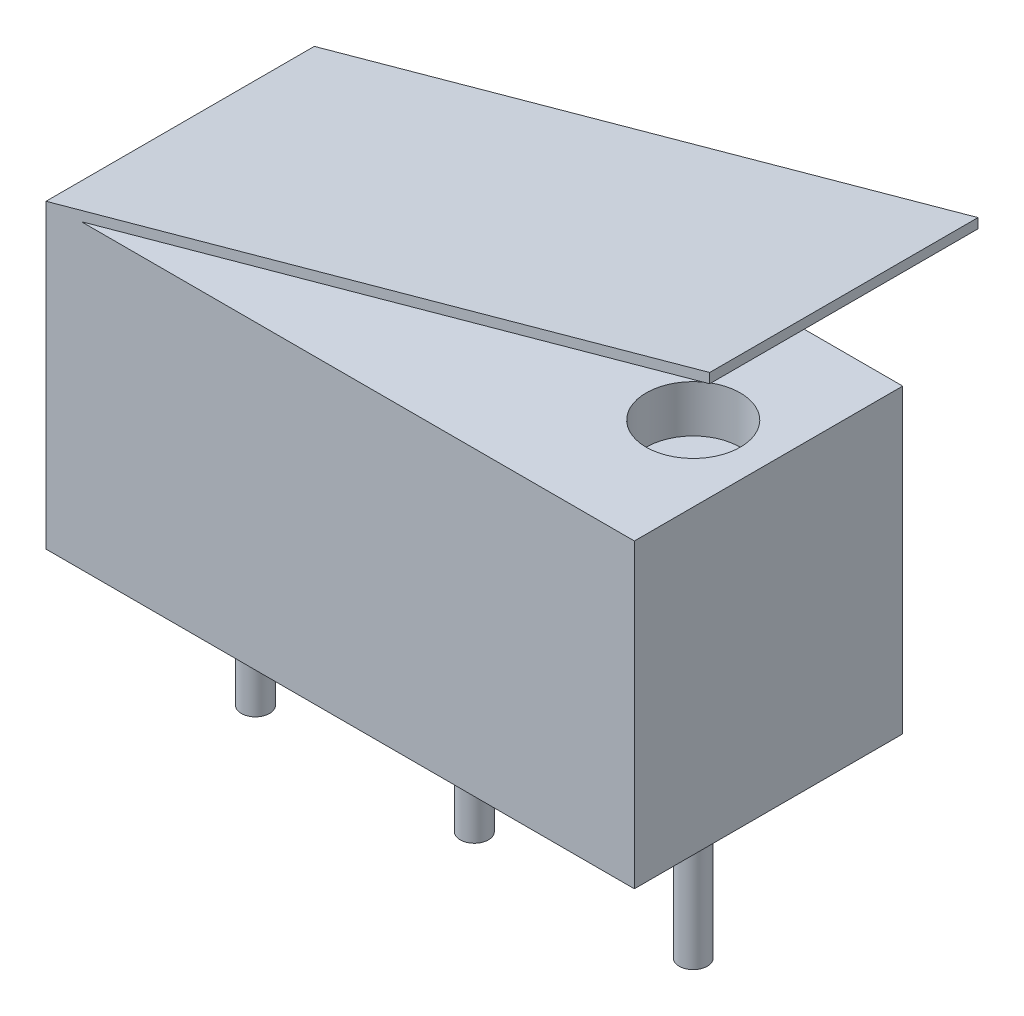
ISO-10303-21;
HEADER;
FILE_DESCRIPTION(('STEP AP214'),'2;1');
FILE_NAME('part.step','',(''),(''),'','','');
FILE_SCHEMA(('AUTOMOTIVE_DESIGN { 1 0 10303 214 1 1 1 1 }'));
ENDSEC;
DATA;
#1=APPLICATION_CONTEXT('core data for automotive mechanical design processes');
#2=APPLICATION_PROTOCOL_DEFINITION('international standard','automotive_design',2000,#1);
#3=PRODUCT_CONTEXT('',#1,'mechanical');
#4=PRODUCT('Part','Part','',(#3));
#5=PRODUCT_RELATED_PRODUCT_CATEGORY('part','',(#4));
#6=PRODUCT_DEFINITION_FORMATION('','',#4);
#7=PRODUCT_DEFINITION_CONTEXT('part definition',#1,'design');
#8=PRODUCT_DEFINITION('design','',#6,#7);
#9=PRODUCT_DEFINITION_SHAPE('','',#8);
#10=(LENGTH_UNIT() NAMED_UNIT(*) SI_UNIT(.MILLI.,.METRE.));
#11=(NAMED_UNIT(*) PLANE_ANGLE_UNIT() SI_UNIT($,.RADIAN.));
#12=(NAMED_UNIT(*) SI_UNIT($,.STERADIAN.) SOLID_ANGLE_UNIT());
#13=UNCERTAINTY_MEASURE_WITH_UNIT(LENGTH_MEASURE(1.E-05),#10,'distance_accuracy_value','');
#14=(GEOMETRIC_REPRESENTATION_CONTEXT(3) GLOBAL_UNCERTAINTY_ASSIGNED_CONTEXT((#13)) GLOBAL_UNIT_ASSIGNED_CONTEXT((#10,
#11,#12)) REPRESENTATION_CONTEXT('',''));
#15=CARTESIAN_POINT('',(0.,0.,0.));
#16=DIRECTION('',(0.,0.,1.));
#17=DIRECTION('',(1.,0.,0.));
#18=AXIS2_PLACEMENT_3D('',#15,#16,#17);
#19=CARTESIAN_POINT('',(-5.11363636363637,6.4,-3.35624999999999));
#20=DIRECTION('',(1.,0.,0.));
#21=DIRECTION('',(0.,0.,-1.));
#22=AXIS2_PLACEMENT_3D('',#19,#20,#21);
#23=PLANE('',#22);
#24=DIRECTION('',(0.,0.,1.));
#25=VECTOR('',#24,1.);
#26=CARTESIAN_POINT('',(-5.11363636363637,0.,-3.35624999999999));
#27=LINE('',#26,#25);
#28=CARTESIAN_POINT('',(-5.11363636363637,0.,-3.35624999999999));
#29=VERTEX_POINT('',#28);
#30=CARTESIAN_POINT('',(-5.11363636363637,0.,2.34375000000001));
#31=VERTEX_POINT('',#30);
#32=EDGE_CURVE('E125',#29,#31,#27,.T.);
#33=ORIENTED_EDGE('',*,*,#32,.T.);
#34=DIRECTION('',(0.,-1.,0.));
#35=VECTOR('',#34,1.);
#36=CARTESIAN_POINT('',(-5.11363636363637,6.4,2.34375000000001));
#37=LINE('',#36,#35);
#38=CARTESIAN_POINT('',(-5.11363636363637,6.4,2.34375000000001));
#39=VERTEX_POINT('',#38);
#40=EDGE_CURVE('E151',#39,#31,#37,.T.);
#41=ORIENTED_EDGE('',*,*,#40,.F.);
#42=DIRECTION('',(0.,0.,1.));
#43=VECTOR('',#42,1.);
#44=CARTESIAN_POINT('',(-5.11363636363637,6.4,-3.35624999999999));
#45=LINE('',#44,#43);
#46=CARTESIAN_POINT('',(-5.11363636363637,6.4,-3.35624999999999));
#47=VERTEX_POINT('',#46);
#48=EDGE_CURVE('E127',#47,#39,#45,.T.);
#49=ORIENTED_EDGE('',*,*,#48,.F.);
#50=DIRECTION('',(0.,-1.,0.));
#51=VECTOR('',#50,1.);
#52=CARTESIAN_POINT('',(-5.11363636363637,6.4,-3.35624999999999));
#53=LINE('',#52,#51);
#54=EDGE_CURVE('E135',#47,#29,#53,.T.);
#55=ORIENTED_EDGE('',*,*,#54,.T.);
#56=EDGE_LOOP('',(#33,#41,#49,#55));
#57=FACE_BOUND('',#56,.T.);
#58=ADVANCED_FACE('F37',(#57),#23,.F.);
#59=CARTESIAN_POINT('',(-5.11363636363637,6.4,2.34375000000001));
#60=DIRECTION('',(0.,0.,-1.));
#61=DIRECTION('',(-1.,0.,0.));
#62=AXIS2_PLACEMENT_3D('',#59,#60,#61);
#63=PLANE('',#62);
#64=DIRECTION('',(1.,0.,0.));
#65=VECTOR('',#64,1.);
#66=CARTESIAN_POINT('',(-5.11363636363637,6.4,2.34375000000001));
#67=LINE('',#66,#65);
#68=CARTESIAN_POINT('',(-4.36340957346796,6.4,2.34375000000001));
#69=VERTEX_POINT('',#68);
#70=CARTESIAN_POINT('',(7.38636363636363,6.4,2.34375000000001));
#71=VERTEX_POINT('',#70);
#72=EDGE_CURVE('E101',#69,#71,#67,.T.);
#73=ORIENTED_EDGE('',*,*,#72,.F.);
#74=DIRECTION('',(0.963811120254198,0.266586054538395,0.));
#75=VECTOR('',#74,1.);
#76=CARTESIAN_POINT('',(-5.11363636363637,6.19249046229385,2.34375000000001));
#77=LINE('',#76,#75);
#78=CARTESIAN_POINT('',(8.98636363636363,10.0924904622938,2.34375000000001));
#79=VERTEX_POINT('',#78);
#80=EDGE_CURVE('E93',#69,#79,#77,.T.);
#81=ORIENTED_EDGE('',*,*,#80,.T.);
#82=DIRECTION('',(0.,1.,0.));
#83=VECTOR('',#82,1.);
#84=CARTESIAN_POINT('',(8.98636363636363,10.3,2.34375000000001));
#85=LINE('',#84,#83);
#86=CARTESIAN_POINT('',(8.98636363636363,10.3,2.34375000000001));
#87=VERTEX_POINT('',#86);
#88=EDGE_CURVE('E98',#79,#87,#85,.T.);
#89=ORIENTED_EDGE('',*,*,#88,.T.);
#90=DIRECTION('',(-0.963811120254198,-0.266586054538395,0.));
#91=VECTOR('',#90,1.);
#92=CARTESIAN_POINT('',(-5.11363636363637,6.4,2.34375000000001));
#93=LINE('',#92,#91);
#94=EDGE_CURVE('E114',#87,#39,#93,.T.);
#95=ORIENTED_EDGE('',*,*,#94,.T.);
#96=ORIENTED_EDGE('',*,*,#40,.T.);
#97=DIRECTION('',(1.,0.,0.));
#98=VECTOR('',#97,1.);
#99=CARTESIAN_POINT('',(-5.11363636363637,0.,2.34375000000001));
#100=LINE('',#99,#98);
#101=CARTESIAN_POINT('',(7.38636363636363,0.,2.34375000000001));
#102=VERTEX_POINT('',#101);
#103=EDGE_CURVE('E138',#31,#102,#100,.T.);
#104=ORIENTED_EDGE('',*,*,#103,.T.);
#105=DIRECTION('',(0.,-1.,0.));
#106=VECTOR('',#105,1.);
#107=CARTESIAN_POINT('',(7.38636363636363,6.4,2.34375000000001));
#108=LINE('',#107,#106);
#109=EDGE_CURVE('E148',#71,#102,#108,.T.);
#110=ORIENTED_EDGE('',*,*,#109,.F.);
#111=EDGE_LOOP('',(#73,#81,#89,#95,#96,#104,#110));
#112=FACE_BOUND('',#111,.T.);
#113=ADVANCED_FACE('F95',(#112),#63,.F.);
#114=CARTESIAN_POINT('',(7.38636363636363,6.4,-3.35624999999999));
#115=DIRECTION('',(-1.,0.,0.));
#116=DIRECTION('',(0.,0.,1.));
#117=AXIS2_PLACEMENT_3D('',#114,#115,#116);
#118=PLANE('',#117);
#119=DIRECTION('',(0.,0.,-1.));
#120=VECTOR('',#119,1.);
#121=CARTESIAN_POINT('',(7.38636363636363,0.,-3.35624999999999));
#122=LINE('',#121,#120);
#123=CARTESIAN_POINT('',(7.38636363636363,0.,-3.35624999999999));
#124=VERTEX_POINT('',#123);
#125=EDGE_CURVE('E140',#102,#124,#122,.T.);
#126=ORIENTED_EDGE('',*,*,#125,.T.);
#127=DIRECTION('',(0.,-1.,0.));
#128=VECTOR('',#127,1.);
#129=CARTESIAN_POINT('',(7.38636363636363,6.4,-3.35624999999999));
#130=LINE('',#129,#128);
#131=CARTESIAN_POINT('',(7.38636363636363,6.4,-3.35624999999999));
#132=VERTEX_POINT('',#131);
#133=EDGE_CURVE('E145',#132,#124,#130,.T.);
#134=ORIENTED_EDGE('',*,*,#133,.F.);
#135=DIRECTION('',(0.,0.,-1.));
#136=VECTOR('',#135,1.);
#137=CARTESIAN_POINT('',(7.38636363636363,6.4,-3.35624999999999));
#138=LINE('',#137,#136);
#139=EDGE_CURVE('E132',#71,#132,#138,.T.);
#140=ORIENTED_EDGE('',*,*,#139,.F.);
#141=ORIENTED_EDGE('',*,*,#109,.T.);
#142=EDGE_LOOP('',(#126,#134,#140,#141));
#143=FACE_BOUND('',#142,.T.);
#144=ADVANCED_FACE('F182',(#143),#118,.F.);
#145=CARTESIAN_POINT('',(-5.11363636363637,6.4,-3.35624999999999));
#146=DIRECTION('',(0.,0.,1.));
#147=DIRECTION('',(1.,0.,0.));
#148=AXIS2_PLACEMENT_3D('',#145,#146,#147);
#149=PLANE('',#148);
#150=DIRECTION('',(-1.,0.,0.));
#151=VECTOR('',#150,1.);
#152=CARTESIAN_POINT('',(-5.11363636363637,0.,-3.35624999999999));
#153=LINE('',#152,#151);
#154=EDGE_CURVE('E130',#124,#29,#153,.T.);
#155=ORIENTED_EDGE('',*,*,#154,.T.);
#156=ORIENTED_EDGE('',*,*,#54,.F.);
#157=DIRECTION('',(0.963811120254198,0.266586054538395,0.));
#158=VECTOR('',#157,1.);
#159=CARTESIAN_POINT('',(-5.11363636363637,6.4,-3.35624999999999));
#160=LINE('',#159,#158);
#161=CARTESIAN_POINT('',(8.98636363636363,10.3,-3.35624999999999));
#162=VERTEX_POINT('',#161);
#163=EDGE_CURVE('E126',#47,#162,#160,.T.);
#164=ORIENTED_EDGE('',*,*,#163,.T.);
#165=DIRECTION('',(0.,-1.,0.));
#166=VECTOR('',#165,1.);
#167=CARTESIAN_POINT('',(8.98636363636363,10.3,-3.35624999999999));
#168=LINE('',#167,#166);
#169=CARTESIAN_POINT('',(8.98636363636363,10.0924904622938,-3.35624999999999));
#170=VERTEX_POINT('',#169);
#171=EDGE_CURVE('E122',#162,#170,#168,.T.);
#172=ORIENTED_EDGE('',*,*,#171,.T.);
#173=DIRECTION('',(-0.963811120254198,-0.266586054538395,0.));
#174=VECTOR('',#173,1.);
#175=CARTESIAN_POINT('',(-5.11363636363637,6.19249046229385,-3.35624999999999));
#176=LINE('',#175,#174);
#177=CARTESIAN_POINT('',(-4.36340957346796,6.4,-3.35624999999999));
#178=VERTEX_POINT('',#177);
#179=EDGE_CURVE('E110',#170,#178,#176,.T.);
#180=ORIENTED_EDGE('',*,*,#179,.T.);
#181=DIRECTION('',(-1.,0.,0.));
#182=VECTOR('',#181,1.);
#183=CARTESIAN_POINT('',(-5.11363636363637,6.4,-3.35624999999999));
#184=LINE('',#183,#182);
#185=EDGE_CURVE('E51',#132,#178,#184,.T.);
#186=ORIENTED_EDGE('',*,*,#185,.F.);
#187=ORIENTED_EDGE('',*,*,#133,.T.);
#188=EDGE_LOOP('',(#155,#156,#164,#172,#180,#186,#187));
#189=FACE_BOUND('',#188,.T.);
#190=ADVANCED_FACE('F178',(#189),#149,.F.);
#191=CARTESIAN_POINT('',(0.,6.4,0.));
#192=DIRECTION('',(0.,1.,0.));
#193=DIRECTION('',(0.,0.,1.));
#194=AXIS2_PLACEMENT_3D('',#191,#192,#193);
#195=PLANE('',#194);
#196=CARTESIAN_POINT('',(5.78636363636363,6.4,-0.506249999999992));
#197=DIRECTION('',(0.,1.,0.));
#198=DIRECTION('',(0.,0.,1.));
#199=AXIS2_PLACEMENT_3D('',#196,#197,#198);
#200=CIRCLE('',#199,1.);
#201=CARTESIAN_POINT('',(5.78636363636363,6.4,0.493750000000007));
#202=VERTEX_POINT('',#201);
#203=EDGE_CURVE('E195',#202,#202,#200,.T.);
#204=ORIENTED_EDGE('',*,*,#203,.F.);
#205=EDGE_LOOP('',(#204));
#206=FACE_BOUND('',#205,.T.);
#207=DIRECTION('',(0.,0.,-1.));
#208=VECTOR('',#207,1.);
#209=CARTESIAN_POINT('',(-4.36340957346797,6.4,0.));
#210=LINE('',#209,#208);
#211=EDGE_CURVE('E55',#69,#178,#210,.T.);
#212=ORIENTED_EDGE('',*,*,#211,.F.);
#213=ORIENTED_EDGE('',*,*,#72,.T.);
#214=ORIENTED_EDGE('',*,*,#139,.T.);
#215=ORIENTED_EDGE('',*,*,#185,.T.);
#216=EDGE_LOOP('',(#212,#213,#214,#215));
#217=FACE_BOUND('',#216,.T.);
#218=ADVANCED_FACE('F165',(#206,#217),#195,.T.);
#219=CARTESIAN_POINT('',(0.,0.,0.));
#220=DIRECTION('',(0.,1.,0.));
#221=DIRECTION('',(0.,0.,1.));
#222=AXIS2_PLACEMENT_3D('',#219,#220,#221);
#223=PLANE('',#222);
#224=CARTESIAN_POINT('',(5.78636363636363,0.,-0.506249999999992));
#225=DIRECTION('',(0.,1.,0.));
#226=DIRECTION('',(0.,0.,1.));
#227=AXIS2_PLACEMENT_3D('',#224,#225,#226);
#228=CIRCLE('',#227,0.3);
#229=CARTESIAN_POINT('',(5.78636363636363,0.,-0.206249999999992));
#230=VERTEX_POINT('',#229);
#231=EDGE_CURVE('E12',#230,#230,#228,.F.);
#232=ORIENTED_EDGE('',*,*,#231,.F.);
#233=EDGE_LOOP('',(#232));
#234=FACE_BOUND('',#233,.T.);
#235=CARTESIAN_POINT('',(1.13636363636363,0.,-0.506249999999994));
#236=DIRECTION('',(0.,1.,0.));
#237=DIRECTION('',(0.,0.,1.));
#238=AXIS2_PLACEMENT_3D('',#235,#236,#237);
#239=CIRCLE('',#238,0.3);
#240=CARTESIAN_POINT('',(1.13636363636363,0.,-0.206249999999994));
#241=VERTEX_POINT('',#240);
#242=EDGE_CURVE('E44',#241,#241,#239,.F.);
#243=ORIENTED_EDGE('',*,*,#242,.F.);
#244=EDGE_LOOP('',(#243));
#245=FACE_BOUND('',#244,.T.);
#246=CARTESIAN_POINT('',(-3.51363636363638,0.,-0.506249999999994));
#247=DIRECTION('',(0.,1.,0.));
#248=DIRECTION('',(0.,0.,1.));
#249=AXIS2_PLACEMENT_3D('',#246,#247,#248);
#250=CIRCLE('',#249,0.3);
#251=CARTESIAN_POINT('',(-3.51363636363638,0.,-0.206249999999994));
#252=VERTEX_POINT('',#251);
#253=EDGE_CURVE('E154',#252,#252,#250,.F.);
#254=ORIENTED_EDGE('',*,*,#253,.F.);
#255=EDGE_LOOP('',(#254));
#256=FACE_BOUND('',#255,.T.);
#257=ORIENTED_EDGE('',*,*,#32,.F.);
#258=ORIENTED_EDGE('',*,*,#154,.F.);
#259=ORIENTED_EDGE('',*,*,#125,.F.);
#260=ORIENTED_EDGE('',*,*,#103,.F.);
#261=EDGE_LOOP('',(#257,#258,#259,#260));
#262=FACE_BOUND('',#261,.T.);
#263=ADVANCED_FACE('F161',(#234,#245,#256,#262),#223,.F.);
#264=CARTESIAN_POINT('',(-5.11363636363637,6.4,-18.042353451983));
#265=DIRECTION('',(-0.266586054538395,0.963811120254198,0.));
#266=DIRECTION('',(-0.963811120254198,-0.266586054538395,0.));
#267=AXIS2_PLACEMENT_3D('',#264,#265,#266);
#268=PLANE('',#267);
#269=ORIENTED_EDGE('',*,*,#163,.F.);
#270=ORIENTED_EDGE('',*,*,#48,.T.);
#271=ORIENTED_EDGE('',*,*,#94,.F.);
#272=DIRECTION('',(0.,0.,1.));
#273=VECTOR('',#272,1.);
#274=CARTESIAN_POINT('',(8.98636363636363,10.3,-18.042353451983));
#275=LINE('',#274,#273);
#276=EDGE_CURVE('E113',#162,#87,#275,.T.);
#277=ORIENTED_EDGE('',*,*,#276,.F.);
#278=EDGE_LOOP('',(#269,#270,#271,#277));
#279=FACE_BOUND('',#278,.T.);
#280=ADVANCED_FACE('F164',(#279),#268,.T.);
#281=CARTESIAN_POINT('',(8.98636363636363,10.3,-18.042353451983));
#282=DIRECTION('',(1.,0.,0.));
#283=DIRECTION('',(0.,1.,0.));
#284=AXIS2_PLACEMENT_3D('',#281,#282,#283);
#285=PLANE('',#284);
#286=ORIENTED_EDGE('',*,*,#171,.F.);
#287=ORIENTED_EDGE('',*,*,#276,.T.);
#288=ORIENTED_EDGE('',*,*,#88,.F.);
#289=DIRECTION('',(0.,0.,1.));
#290=VECTOR('',#289,1.);
#291=CARTESIAN_POINT('',(8.98636363636363,10.0924904622938,-18.042353451983));
#292=LINE('',#291,#290);
#293=EDGE_CURVE('E107',#170,#79,#292,.T.);
#294=ORIENTED_EDGE('',*,*,#293,.F.);
#295=EDGE_LOOP('',(#286,#287,#288,#294));
#296=FACE_BOUND('',#295,.T.);
#297=ADVANCED_FACE('F116',(#296),#285,.T.);
#298=CARTESIAN_POINT('',(-5.11363636363637,6.19249046229385,-18.042353451983));
#299=DIRECTION('',(0.266586054538395,-0.963811120254198,0.));
#300=DIRECTION('',(0.963811120254198,0.266586054538395,0.));
#301=AXIS2_PLACEMENT_3D('',#298,#299,#300);
#302=PLANE('',#301);
#303=ORIENTED_EDGE('',*,*,#80,.F.);
#304=ORIENTED_EDGE('',*,*,#211,.T.);
#305=ORIENTED_EDGE('',*,*,#179,.F.);
#306=ORIENTED_EDGE('',*,*,#293,.T.);
#307=EDGE_LOOP('',(#303,#304,#305,#306));
#308=FACE_BOUND('',#307,.T.);
#309=ADVANCED_FACE('F108',(#308),#302,.T.);
#310=CARTESIAN_POINT('',(-3.51363636363638,-14.2485281374239,-0.506249999999994));
#311=DIRECTION('',(0.,1.,0.));
#312=DIRECTION('',(0.,0.,1.));
#313=AXIS2_PLACEMENT_3D('',#310,#311,#312);
#314=CYLINDRICAL_SURFACE('',#313,0.3);
#315=CARTESIAN_POINT('',(-3.51363636363638,-3.5,-0.506249999999994));
#316=DIRECTION('',(0.,1.,0.));
#317=DIRECTION('',(0.,0.,1.));
#318=AXIS2_PLACEMENT_3D('',#315,#316,#317);
#319=CIRCLE('',#318,0.3);
#320=CARTESIAN_POINT('',(-3.51363636363638,-3.5,-0.206249999999994));
#321=VERTEX_POINT('',#320);
#322=EDGE_CURVE('E103',#321,#321,#319,.T.);
#323=ORIENTED_EDGE('',*,*,#322,.T.);
#324=EDGE_LOOP('',(#323));
#325=FACE_BOUND('',#324,.T.);
#326=ORIENTED_EDGE('',*,*,#253,.T.);
#327=EDGE_LOOP('',(#326));
#328=FACE_BOUND('',#327,.T.);
#329=ADVANCED_FACE('F261',(#325,#328),#314,.T.);
#330=CARTESIAN_POINT('',(0.,-3.5,0.));
#331=DIRECTION('',(0.,1.,0.));
#332=DIRECTION('',(0.,0.,1.));
#333=AXIS2_PLACEMENT_3D('',#330,#331,#332);
#334=PLANE('',#333);
#335=ORIENTED_EDGE('',*,*,#322,.F.);
#336=EDGE_LOOP('',(#335));
#337=FACE_BOUND('',#336,.T.);
#338=ADVANCED_FACE('F266',(#337),#334,.F.);
#339=CARTESIAN_POINT('',(1.13636363636363,-14.2485281374239,-0.506249999999994));
#340=DIRECTION('',(0.,1.,0.));
#341=DIRECTION('',(0.,0.,1.));
#342=AXIS2_PLACEMENT_3D('',#339,#340,#341);
#343=CYLINDRICAL_SURFACE('',#342,0.3);
#344=CARTESIAN_POINT('',(1.13636363636363,-3.5,-0.506249999999994));
#345=DIRECTION('',(0.,1.,0.));
#346=DIRECTION('',(0.,0.,1.));
#347=AXIS2_PLACEMENT_3D('',#344,#345,#346);
#348=CIRCLE('',#347,0.3);
#349=CARTESIAN_POINT('',(1.13636363636363,-3.5,-0.206249999999994));
#350=VERTEX_POINT('',#349);
#351=EDGE_CURVE('E188',#350,#350,#348,.T.);
#352=ORIENTED_EDGE('',*,*,#351,.T.);
#353=EDGE_LOOP('',(#352));
#354=FACE_BOUND('',#353,.T.);
#355=ORIENTED_EDGE('',*,*,#242,.T.);
#356=EDGE_LOOP('',(#355));
#357=FACE_BOUND('',#356,.T.);
#358=ADVANCED_FACE('F159',(#354,#357),#343,.T.);
#359=CARTESIAN_POINT('',(0.,-3.5,0.));
#360=DIRECTION('',(0.,1.,0.));
#361=DIRECTION('',(0.,0.,1.));
#362=AXIS2_PLACEMENT_3D('',#359,#360,#361);
#363=PLANE('',#362);
#364=ORIENTED_EDGE('',*,*,#351,.F.);
#365=EDGE_LOOP('',(#364));
#366=FACE_BOUND('',#365,.T.);
#367=ADVANCED_FACE('F281',(#366),#363,.F.);
#368=CARTESIAN_POINT('',(5.78636363636363,-14.2485281374239,-0.506249999999992));
#369=DIRECTION('',(0.,1.,0.));
#370=DIRECTION('',(0.,0.,1.));
#371=AXIS2_PLACEMENT_3D('',#368,#369,#370);
#372=CYLINDRICAL_SURFACE('',#371,0.3);
#373=CARTESIAN_POINT('',(5.78636363636363,-3.5,-0.506249999999992));
#374=DIRECTION('',(0.,1.,0.));
#375=DIRECTION('',(0.,0.,1.));
#376=AXIS2_PLACEMENT_3D('',#373,#374,#375);
#377=CIRCLE('',#376,0.3);
#378=CARTESIAN_POINT('',(5.78636363636363,-3.5,-0.206249999999992));
#379=VERTEX_POINT('',#378);
#380=EDGE_CURVE('E191',#379,#379,#377,.T.);
#381=ORIENTED_EDGE('',*,*,#380,.T.);
#382=EDGE_LOOP('',(#381));
#383=FACE_BOUND('',#382,.T.);
#384=ORIENTED_EDGE('',*,*,#231,.T.);
#385=EDGE_LOOP('',(#384));
#386=FACE_BOUND('',#385,.T.);
#387=ADVANCED_FACE('F289',(#383,#386),#372,.T.);
#388=CARTESIAN_POINT('',(0.,-3.5,0.));
#389=DIRECTION('',(0.,1.,0.));
#390=DIRECTION('',(0.,0.,1.));
#391=AXIS2_PLACEMENT_3D('',#388,#389,#390);
#392=PLANE('',#391);
#393=ORIENTED_EDGE('',*,*,#380,.F.);
#394=EDGE_LOOP('',(#393));
#395=FACE_BOUND('',#394,.T.);
#396=ADVANCED_FACE('F206',(#395),#392,.F.);
#397=CARTESIAN_POINT('',(5.78636363636363,5.4,-0.506249999999992));
#398=DIRECTION('',(0.,1.,0.));
#399=DIRECTION('',(0.,0.,1.));
#400=AXIS2_PLACEMENT_3D('',#397,#398,#399);
#401=CYLINDRICAL_SURFACE('',#400,1.);
#402=CARTESIAN_POINT('',(5.78636363636363,5.4,-0.506249999999992));
#403=DIRECTION('',(0.,1.,0.));
#404=DIRECTION('',(0.,0.,1.));
#405=AXIS2_PLACEMENT_3D('',#402,#403,#404);
#406=CIRCLE('',#405,1.);
#407=CARTESIAN_POINT('',(5.78636363636363,5.4,0.493750000000007));
#408=VERTEX_POINT('',#407);
#409=EDGE_CURVE('E194',#408,#408,#406,.T.);
#410=ORIENTED_EDGE('',*,*,#409,.F.);
#411=EDGE_LOOP('',(#410));
#412=FACE_BOUND('',#411,.T.);
#413=ORIENTED_EDGE('',*,*,#203,.T.);
#414=EDGE_LOOP('',(#413));
#415=FACE_BOUND('',#414,.T.);
#416=ADVANCED_FACE('F203',(#412,#415),#401,.F.);
#417=CARTESIAN_POINT('',(5.78636363636363,5.4,-0.506249999999992));
#418=DIRECTION('',(0.,1.,0.));
#419=DIRECTION('',(0.,0.,1.));
#420=AXIS2_PLACEMENT_3D('',#417,#418,#419);
#421=PLANE('',#420);
#422=ORIENTED_EDGE('',*,*,#409,.T.);
#423=EDGE_LOOP('',(#422));
#424=FACE_BOUND('',#423,.T.);
#425=ADVANCED_FACE('F201',(#424),#421,.T.);
#426=CLOSED_SHELL('',(#58,#113,#144,#190,#218,#263,#280,#297,#309,#329,#338,#358,#367,#387,#396,
#416,#425));
#427=MANIFOLD_SOLID_BREP('B2',#426);
#428=ADVANCED_BREP_SHAPE_REPRESENTATION('',(#18,#427),#14);
#429=SHAPE_DEFINITION_REPRESENTATION(#9,#428);
ENDSEC;
END-ISO-10303-21;
